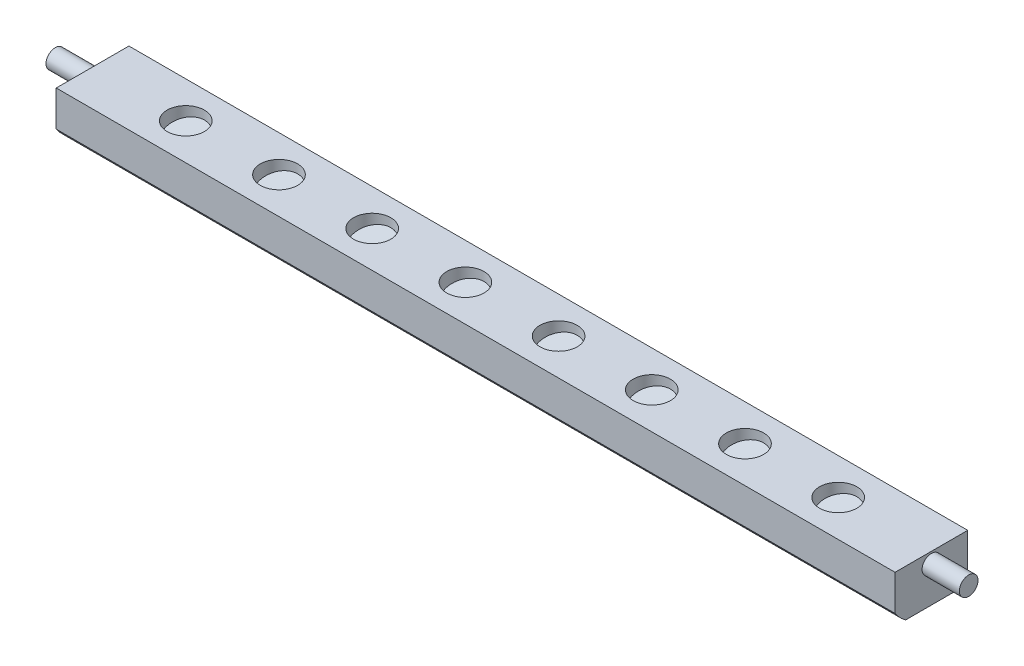
ISO-10303-21;
HEADER;
FILE_DESCRIPTION(('STEP AP214'),'2;1');
FILE_NAME('part.step','',(''),(''),'','','');
FILE_SCHEMA(('AUTOMOTIVE_DESIGN { 1 0 10303 214 1 1 1 1 }'));
ENDSEC;
DATA;
#1=APPLICATION_CONTEXT('core data for automotive mechanical design processes');
#2=APPLICATION_PROTOCOL_DEFINITION('international standard','automotive_design',2000,#1);
#3=PRODUCT_CONTEXT('',#1,'mechanical');
#4=PRODUCT('Part','Part','',(#3));
#5=PRODUCT_RELATED_PRODUCT_CATEGORY('part','',(#4));
#6=PRODUCT_DEFINITION_FORMATION('','',#4);
#7=PRODUCT_DEFINITION_CONTEXT('part definition',#1,'design');
#8=PRODUCT_DEFINITION('design','',#6,#7);
#9=PRODUCT_DEFINITION_SHAPE('','',#8);
#10=(LENGTH_UNIT() NAMED_UNIT(*) SI_UNIT(.MILLI.,.METRE.));
#11=(NAMED_UNIT(*) PLANE_ANGLE_UNIT() SI_UNIT($,.RADIAN.));
#12=(NAMED_UNIT(*) SI_UNIT($,.STERADIAN.) SOLID_ANGLE_UNIT());
#13=UNCERTAINTY_MEASURE_WITH_UNIT(LENGTH_MEASURE(1.E-05),#10,'distance_accuracy_value','');
#14=(GEOMETRIC_REPRESENTATION_CONTEXT(3) GLOBAL_UNCERTAINTY_ASSIGNED_CONTEXT((#13)) GLOBAL_UNIT_ASSIGNED_CONTEXT((#10,
#11,#12)) REPRESENTATION_CONTEXT('',''));
#15=CARTESIAN_POINT('',(0.,0.,0.));
#16=DIRECTION('',(0.,0.,1.));
#17=DIRECTION('',(1.,0.,0.));
#18=AXIS2_PLACEMENT_3D('',#15,#16,#17);
#19=CARTESIAN_POINT('',(175.,0.,0.));
#20=DIRECTION('',(0.,1.,0.));
#21=DIRECTION('',(-1.,0.,0.));
#22=AXIS2_PLACEMENT_3D('',#19,#20,#21);
#23=CYLINDRICAL_SURFACE('',#22,10.);
#24=CARTESIAN_POINT('',(175.,2.67949192431123,0.));
#25=DIRECTION('',(0.,0.965925826289068,0.258819045102521));
#26=DIRECTION('',(0.,0.258819045102521,-0.965925826289068));
#27=AXIS2_PLACEMENT_3D('',#24,#25,#26);
#28=ELLIPSE('',#27,10.3527618041008,10.);
#29=CARTESIAN_POINT('',(175.,5.35898384862246,-10.));
#30=VERTEX_POINT('',#29);
#31=EDGE_CURVE('E147',#30,#30,#28,.F.);
#32=ORIENTED_EDGE('',*,*,#31,.T.);
#33=EDGE_LOOP('',(#32));
#34=FACE_BOUND('',#33,.T.);
#35=CARTESIAN_POINT('',(175.,10.,0.));
#36=DIRECTION('',(0.,1.,0.));
#37=DIRECTION('',(-1.,0.,0.));
#38=AXIS2_PLACEMENT_3D('',#35,#36,#37);
#39=CIRCLE('',#38,10.);
#40=CARTESIAN_POINT('',(165.,10.,0.));
#41=VERTEX_POINT('',#40);
#42=EDGE_CURVE('E39',#41,#41,#39,.T.);
#43=ORIENTED_EDGE('',*,*,#42,.T.);
#44=EDGE_LOOP('',(#43));
#45=FACE_BOUND('',#44,.T.);
#46=ADVANCED_FACE('F36',(#34,#45),#23,.F.);
#47=CARTESIAN_POINT('',(125.,0.,0.));
#48=DIRECTION('',(0.,1.,0.));
#49=DIRECTION('',(-1.,0.,0.));
#50=AXIS2_PLACEMENT_3D('',#47,#48,#49);
#51=CYLINDRICAL_SURFACE('',#50,10.);
#52=CARTESIAN_POINT('',(125.,2.67949192431123,0.));
#53=DIRECTION('',(0.,0.965925826289068,0.258819045102521));
#54=DIRECTION('',(0.,0.258819045102521,-0.965925826289068));
#55=AXIS2_PLACEMENT_3D('',#52,#53,#54);
#56=ELLIPSE('',#55,10.3527618041008,10.);
#57=CARTESIAN_POINT('',(125.,5.35898384862246,-10.));
#58=VERTEX_POINT('',#57);
#59=EDGE_CURVE('E144',#58,#58,#56,.F.);
#60=ORIENTED_EDGE('',*,*,#59,.T.);
#61=EDGE_LOOP('',(#60));
#62=FACE_BOUND('',#61,.T.);
#63=CARTESIAN_POINT('',(125.,10.,0.));
#64=DIRECTION('',(0.,1.,0.));
#65=DIRECTION('',(-1.,0.,0.));
#66=AXIS2_PLACEMENT_3D('',#63,#64,#65);
#67=CIRCLE('',#66,10.);
#68=CARTESIAN_POINT('',(115.,10.,0.));
#69=VERTEX_POINT('',#68);
#70=EDGE_CURVE('E178',#69,#69,#67,.T.);
#71=ORIENTED_EDGE('',*,*,#70,.T.);
#72=EDGE_LOOP('',(#71));
#73=FACE_BOUND('',#72,.T.);
#74=ADVANCED_FACE('F203',(#62,#73),#51,.F.);
#75=CARTESIAN_POINT('',(75.,0.,0.));
#76=DIRECTION('',(0.,1.,0.));
#77=DIRECTION('',(-1.,0.,0.));
#78=AXIS2_PLACEMENT_3D('',#75,#76,#77);
#79=CYLINDRICAL_SURFACE('',#78,10.);
#80=CARTESIAN_POINT('',(75.,2.67949192431123,0.));
#81=DIRECTION('',(0.,0.965925826289068,0.258819045102521));
#82=DIRECTION('',(0.,0.258819045102521,-0.965925826289068));
#83=AXIS2_PLACEMENT_3D('',#80,#81,#82);
#84=ELLIPSE('',#83,10.3527618041008,10.);
#85=CARTESIAN_POINT('',(75.,5.35898384862246,-10.));
#86=VERTEX_POINT('',#85);
#87=EDGE_CURVE('E141',#86,#86,#84,.F.);
#88=ORIENTED_EDGE('',*,*,#87,.T.);
#89=EDGE_LOOP('',(#88));
#90=FACE_BOUND('',#89,.T.);
#91=CARTESIAN_POINT('',(75.,10.,0.));
#92=DIRECTION('',(0.,1.,0.));
#93=DIRECTION('',(-1.,0.,0.));
#94=AXIS2_PLACEMENT_3D('',#91,#92,#93);
#95=CIRCLE('',#94,10.);
#96=CARTESIAN_POINT('',(65.,10.,0.));
#97=VERTEX_POINT('',#96);
#98=EDGE_CURVE('E176',#97,#97,#95,.T.);
#99=ORIENTED_EDGE('',*,*,#98,.T.);
#100=EDGE_LOOP('',(#99));
#101=FACE_BOUND('',#100,.T.);
#102=ADVANCED_FACE('F208',(#90,#101),#79,.F.);
#103=CARTESIAN_POINT('',(25.,0.,0.));
#104=DIRECTION('',(0.,1.,0.));
#105=DIRECTION('',(-1.,0.,0.));
#106=AXIS2_PLACEMENT_3D('',#103,#104,#105);
#107=CYLINDRICAL_SURFACE('',#106,10.);
#108=CARTESIAN_POINT('',(25.,2.67949192431123,0.));
#109=DIRECTION('',(0.,0.965925826289068,0.258819045102521));
#110=DIRECTION('',(0.,0.258819045102521,-0.965925826289068));
#111=AXIS2_PLACEMENT_3D('',#108,#109,#110);
#112=ELLIPSE('',#111,10.3527618041008,10.);
#113=CARTESIAN_POINT('',(25.,5.35898384862246,-10.));
#114=VERTEX_POINT('',#113);
#115=EDGE_CURVE('E138',#114,#114,#112,.F.);
#116=ORIENTED_EDGE('',*,*,#115,.T.);
#117=EDGE_LOOP('',(#116));
#118=FACE_BOUND('',#117,.T.);
#119=CARTESIAN_POINT('',(25.,10.,0.));
#120=DIRECTION('',(0.,1.,0.));
#121=DIRECTION('',(-1.,0.,0.));
#122=AXIS2_PLACEMENT_3D('',#119,#120,#121);
#123=CIRCLE('',#122,10.);
#124=CARTESIAN_POINT('',(15.,10.,0.));
#125=VERTEX_POINT('',#124);
#126=EDGE_CURVE('E173',#125,#125,#123,.T.);
#127=ORIENTED_EDGE('',*,*,#126,.T.);
#128=EDGE_LOOP('',(#127));
#129=FACE_BOUND('',#128,.T.);
#130=ADVANCED_FACE('F274',(#118,#129),#107,.F.);
#131=CARTESIAN_POINT('',(-25.,0.,0.));
#132=DIRECTION('',(0.,1.,0.));
#133=DIRECTION('',(-1.,0.,0.));
#134=AXIS2_PLACEMENT_3D('',#131,#132,#133);
#135=CYLINDRICAL_SURFACE('',#134,10.);
#136=CARTESIAN_POINT('',(-25.,2.67949192431123,0.));
#137=DIRECTION('',(0.,0.965925826289068,0.258819045102521));
#138=DIRECTION('',(0.,0.258819045102521,-0.965925826289068));
#139=AXIS2_PLACEMENT_3D('',#136,#137,#138);
#140=ELLIPSE('',#139,10.3527618041008,10.);
#141=CARTESIAN_POINT('',(-25.,5.35898384862246,-10.));
#142=VERTEX_POINT('',#141);
#143=EDGE_CURVE('E135',#142,#142,#140,.F.);
#144=ORIENTED_EDGE('',*,*,#143,.T.);
#145=EDGE_LOOP('',(#144));
#146=FACE_BOUND('',#145,.T.);
#147=CARTESIAN_POINT('',(-25.,10.,0.));
#148=DIRECTION('',(0.,1.,0.));
#149=DIRECTION('',(-1.,0.,0.));
#150=AXIS2_PLACEMENT_3D('',#147,#148,#149);
#151=CIRCLE('',#150,10.);
#152=CARTESIAN_POINT('',(-35.,9.99999999999999,0.));
#153=VERTEX_POINT('',#152);
#154=EDGE_CURVE('E170',#153,#153,#151,.T.);
#155=ORIENTED_EDGE('',*,*,#154,.T.);
#156=EDGE_LOOP('',(#155));
#157=FACE_BOUND('',#156,.T.);
#158=ADVANCED_FACE('F268',(#146,#157),#135,.F.);
#159=CARTESIAN_POINT('',(-75.,0.,0.));
#160=DIRECTION('',(0.,1.,0.));
#161=DIRECTION('',(-1.,0.,0.));
#162=AXIS2_PLACEMENT_3D('',#159,#160,#161);
#163=CYLINDRICAL_SURFACE('',#162,10.);
#164=CARTESIAN_POINT('',(-75.,2.67949192431123,0.));
#165=DIRECTION('',(0.,0.965925826289068,0.258819045102521));
#166=DIRECTION('',(0.,0.258819045102521,-0.965925826289068));
#167=AXIS2_PLACEMENT_3D('',#164,#165,#166);
#168=ELLIPSE('',#167,10.3527618041008,10.);
#169=CARTESIAN_POINT('',(-75.,5.35898384862246,-10.));
#170=VERTEX_POINT('',#169);
#171=EDGE_CURVE('E132',#170,#170,#168,.F.);
#172=ORIENTED_EDGE('',*,*,#171,.T.);
#173=EDGE_LOOP('',(#172));
#174=FACE_BOUND('',#173,.T.);
#175=CARTESIAN_POINT('',(-75.,9.99999999999999,0.));
#176=DIRECTION('',(0.,1.,0.));
#177=DIRECTION('',(-1.,0.,0.));
#178=AXIS2_PLACEMENT_3D('',#175,#176,#177);
#179=CIRCLE('',#178,10.);
#180=CARTESIAN_POINT('',(-85.,9.99999999999999,0.));
#181=VERTEX_POINT('',#180);
#182=EDGE_CURVE('E167',#181,#181,#179,.T.);
#183=ORIENTED_EDGE('',*,*,#182,.T.);
#184=EDGE_LOOP('',(#183));
#185=FACE_BOUND('',#184,.T.);
#186=ADVANCED_FACE('F263',(#174,#185),#163,.F.);
#187=CARTESIAN_POINT('',(-225.,-10.,14.));
#188=DIRECTION('',(1.,0.,0.));
#189=DIRECTION('',(0.,0.,-1.));
#190=AXIS2_PLACEMENT_3D('',#187,#188,#189);
#191=PLANE('',#190);
#192=CARTESIAN_POINT('',(-225.,4.00000000000003,0.));
#193=DIRECTION('',(1.,0.,0.));
#194=DIRECTION('',(0.,0.,-1.));
#195=AXIS2_PLACEMENT_3D('',#192,#193,#194);
#196=CIRCLE('',#195,5.);
#197=CARTESIAN_POINT('',(-225.,4.00000000000003,-5.));
#198=VERTEX_POINT('',#197);
#199=EDGE_CURVE('E150',#198,#198,#196,.T.);
#200=ORIENTED_EDGE('',*,*,#199,.T.);
#201=EDGE_LOOP('',(#200));
#202=FACE_BOUND('',#201,.T.);
#203=DIRECTION('',(0.,0.,-1.));
#204=VECTOR('',#203,1.);
#205=CARTESIAN_POINT('',(-225.,9.99999999999997,14.));
#206=LINE('',#205,#204);
#207=CARTESIAN_POINT('',(-225.,9.99999999999997,19.5));
#208=VERTEX_POINT('',#207);
#209=CARTESIAN_POINT('',(-225.,9.99999999999997,-19.5));
#210=VERTEX_POINT('',#209);
#211=EDGE_CURVE('E56',#208,#210,#206,.T.);
#212=ORIENTED_EDGE('',*,*,#211,.T.);
#213=DIRECTION('',(0.,-1.,0.));
#214=VECTOR('',#213,1.);
#215=CARTESIAN_POINT('',(-225.,9.99999999999997,-19.5));
#216=LINE('',#215,#214);
#217=CARTESIAN_POINT('',(-225.,-15.,-19.5));
#218=VERTEX_POINT('',#217);
#219=EDGE_CURVE('E51',#210,#218,#216,.T.);
#220=ORIENTED_EDGE('',*,*,#219,.T.);
#221=DIRECTION('',(0.,0.,1.));
#222=VECTOR('',#221,1.);
#223=CARTESIAN_POINT('',(-225.,-15.,-19.5));
#224=LINE('',#223,#222);
#225=CARTESIAN_POINT('',(-225.,-15.,13.8293166859393));
#226=VERTEX_POINT('',#225);
#227=EDGE_CURVE('E112',#218,#226,#224,.T.);
#228=ORIENTED_EDGE('',*,*,#227,.T.);
#229=CARTESIAN_POINT('',(-225.,3.99999999999997,0.));
#230=DIRECTION('',(1.,0.,0.));
#231=DIRECTION('',(0.,0.,-1.));
#232=AXIS2_PLACEMENT_3D('',#229,#230,#231);
#233=CIRCLE('',#232,23.5);
#234=CARTESIAN_POINT('',(-225.,-9.11487704860403,19.5));
#235=VERTEX_POINT('',#234);
#236=EDGE_CURVE('E117',#226,#235,#233,.F.);
#237=ORIENTED_EDGE('',*,*,#236,.T.);
#238=DIRECTION('',(0.,1.,0.));
#239=VECTOR('',#238,1.);
#240=CARTESIAN_POINT('',(-225.,9.99999999999997,19.5));
#241=LINE('',#240,#239);
#242=EDGE_CURVE('E87',#235,#208,#241,.T.);
#243=ORIENTED_EDGE('',*,*,#242,.T.);
#244=EDGE_LOOP('',(#212,#220,#228,#237,#243));
#245=FACE_BOUND('',#244,.T.);
#246=ADVANCED_FACE('F198',(#202,#245),#191,.F.);
#247=CARTESIAN_POINT('',(225.,-9.99999999999997,14.));
#248=DIRECTION('',(-1.,0.,0.));
#249=DIRECTION('',(0.,0.,1.));
#250=AXIS2_PLACEMENT_3D('',#247,#248,#249);
#251=PLANE('',#250);
#252=DIRECTION('',(0.,0.,-1.));
#253=VECTOR('',#252,1.);
#254=CARTESIAN_POINT('',(225.,10.,14.));
#255=LINE('',#254,#253);
#256=CARTESIAN_POINT('',(225.,9.99999999999997,19.5));
#257=VERTEX_POINT('',#256);
#258=CARTESIAN_POINT('',(225.,9.99999999999997,-19.5));
#259=VERTEX_POINT('',#258);
#260=EDGE_CURVE('E101',#257,#259,#255,.T.);
#261=ORIENTED_EDGE('',*,*,#260,.F.);
#262=DIRECTION('',(0.,1.,0.));
#263=VECTOR('',#262,1.);
#264=CARTESIAN_POINT('',(225.,9.99999999999997,19.5));
#265=LINE('',#264,#263);
#266=CARTESIAN_POINT('',(225.,-9.11487704860403,19.5));
#267=VERTEX_POINT('',#266);
#268=EDGE_CURVE('E86',#267,#257,#265,.T.);
#269=ORIENTED_EDGE('',*,*,#268,.F.);
#270=CARTESIAN_POINT('',(225.,3.99999999999997,0.));
#271=DIRECTION('',(-1.,0.,0.));
#272=DIRECTION('',(0.,0.,1.));
#273=AXIS2_PLACEMENT_3D('',#270,#271,#272);
#274=CIRCLE('',#273,23.5);
#275=CARTESIAN_POINT('',(225.,-15.,13.8293166859393));
#276=VERTEX_POINT('',#275);
#277=EDGE_CURVE('E98',#276,#267,#274,.T.);
#278=ORIENTED_EDGE('',*,*,#277,.F.);
#279=DIRECTION('',(0.,0.,1.));
#280=VECTOR('',#279,1.);
#281=CARTESIAN_POINT('',(225.,-15.,-19.5));
#282=LINE('',#281,#280);
#283=CARTESIAN_POINT('',(225.,-15.,-19.5));
#284=VERTEX_POINT('',#283);
#285=EDGE_CURVE('E106',#284,#276,#282,.T.);
#286=ORIENTED_EDGE('',*,*,#285,.F.);
#287=DIRECTION('',(0.,-1.,0.));
#288=VECTOR('',#287,1.);
#289=CARTESIAN_POINT('',(225.,9.99999999999997,-19.5));
#290=LINE('',#289,#288);
#291=EDGE_CURVE('E108',#259,#284,#290,.T.);
#292=ORIENTED_EDGE('',*,*,#291,.F.);
#293=EDGE_LOOP('',(#261,#269,#278,#286,#292));
#294=FACE_BOUND('',#293,.T.);
#295=CARTESIAN_POINT('',(225.,4.00000000000003,0.));
#296=DIRECTION('',(1.,0.,0.));
#297=DIRECTION('',(0.,0.,-1.));
#298=AXIS2_PLACEMENT_3D('',#295,#296,#297);
#299=CIRCLE('',#298,5.);
#300=CARTESIAN_POINT('',(225.,4.00000000000003,-5.));
#301=VERTEX_POINT('',#300);
#302=EDGE_CURVE('E11',#301,#301,#299,.T.);
#303=ORIENTED_EDGE('',*,*,#302,.F.);
#304=EDGE_LOOP('',(#303));
#305=FACE_BOUND('',#304,.T.);
#306=ADVANCED_FACE('F95',(#294,#305),#251,.F.);
#307=CARTESIAN_POINT('',(225.,10.,14.));
#308=DIRECTION('',(0.,-1.,0.));
#309=DIRECTION('',(1.,0.,0.));
#310=AXIS2_PLACEMENT_3D('',#307,#308,#309);
#311=PLANE('',#310);
#312=CARTESIAN_POINT('',(-125.,9.99999999999998,0.));
#313=DIRECTION('',(0.,1.,0.));
#314=DIRECTION('',(-1.,0.,0.));
#315=AXIS2_PLACEMENT_3D('',#312,#313,#314);
#316=CIRCLE('',#315,10.);
#317=CARTESIAN_POINT('',(-135.,9.99999999999998,0.));
#318=VERTEX_POINT('',#317);
#319=EDGE_CURVE('E158',#318,#318,#316,.T.);
#320=ORIENTED_EDGE('',*,*,#319,.F.);
#321=EDGE_LOOP('',(#320));
#322=FACE_BOUND('',#321,.T.);
#323=CARTESIAN_POINT('',(-175.,9.99999999999998,0.));
#324=DIRECTION('',(0.,1.,0.));
#325=DIRECTION('',(-1.,0.,0.));
#326=AXIS2_PLACEMENT_3D('',#323,#324,#325);
#327=CIRCLE('',#326,10.);
#328=CARTESIAN_POINT('',(-185.,9.99999999999998,0.));
#329=VERTEX_POINT('',#328);
#330=EDGE_CURVE('E162',#329,#329,#327,.T.);
#331=ORIENTED_EDGE('',*,*,#330,.F.);
#332=EDGE_LOOP('',(#331));
#333=FACE_BOUND('',#332,.T.);
#334=ORIENTED_EDGE('',*,*,#260,.T.);
#335=DIRECTION('',(1.,0.,0.));
#336=VECTOR('',#335,1.);
#337=CARTESIAN_POINT('',(-271.324939287602,9.99999999999997,-19.5));
#338=LINE('',#337,#336);
#339=EDGE_CURVE('E119',#210,#259,#338,.T.);
#340=ORIENTED_EDGE('',*,*,#339,.F.);
#341=ORIENTED_EDGE('',*,*,#211,.F.);
#342=DIRECTION('',(1.,0.,0.));
#343=VECTOR('',#342,1.);
#344=CARTESIAN_POINT('',(-271.324939287602,9.99999999999997,19.5));
#345=LINE('',#344,#343);
#346=EDGE_CURVE('E114',#208,#257,#345,.T.);
#347=ORIENTED_EDGE('',*,*,#346,.T.);
#348=EDGE_LOOP('',(#334,#340,#341,#347));
#349=FACE_BOUND('',#348,.T.);
#350=ORIENTED_EDGE('',*,*,#182,.F.);
#351=EDGE_LOOP('',(#350));
#352=FACE_BOUND('',#351,.T.);
#353=ORIENTED_EDGE('',*,*,#154,.F.);
#354=EDGE_LOOP('',(#353));
#355=FACE_BOUND('',#354,.T.);
#356=ORIENTED_EDGE('',*,*,#126,.F.);
#357=EDGE_LOOP('',(#356));
#358=FACE_BOUND('',#357,.T.);
#359=ORIENTED_EDGE('',*,*,#98,.F.);
#360=EDGE_LOOP('',(#359));
#361=FACE_BOUND('',#360,.T.);
#362=ORIENTED_EDGE('',*,*,#70,.F.);
#363=EDGE_LOOP('',(#362));
#364=FACE_BOUND('',#363,.T.);
#365=ORIENTED_EDGE('',*,*,#42,.F.);
#366=EDGE_LOOP('',(#365));
#367=FACE_BOUND('',#366,.T.);
#368=ADVANCED_FACE('F186',(#322,#333,#349,#352,#355,#358,#361,#364,#367),#311,.F.);
#369=CARTESIAN_POINT('',(-175.,0.,0.));
#370=DIRECTION('',(0.,1.,0.));
#371=DIRECTION('',(-1.,0.,0.));
#372=AXIS2_PLACEMENT_3D('',#369,#370,#371);
#373=CYLINDRICAL_SURFACE('',#372,10.);
#374=CARTESIAN_POINT('',(-175.,2.67949192431123,0.));
#375=DIRECTION('',(0.,0.965925826289068,0.258819045102521));
#376=DIRECTION('',(0.,0.258819045102521,-0.965925826289068));
#377=AXIS2_PLACEMENT_3D('',#374,#375,#376);
#378=ELLIPSE('',#377,10.3527618041008,10.);
#379=CARTESIAN_POINT('',(-175.,5.35898384862246,-10.));
#380=VERTEX_POINT('',#379);
#381=EDGE_CURVE('E129',#380,#380,#378,.F.);
#382=ORIENTED_EDGE('',*,*,#381,.T.);
#383=EDGE_LOOP('',(#382));
#384=FACE_BOUND('',#383,.T.);
#385=ORIENTED_EDGE('',*,*,#330,.T.);
#386=EDGE_LOOP('',(#385));
#387=FACE_BOUND('',#386,.T.);
#388=ADVANCED_FACE('F188',(#384,#387),#373,.F.);
#389=CARTESIAN_POINT('',(-125.,0.,0.));
#390=DIRECTION('',(0.,1.,0.));
#391=DIRECTION('',(-1.,0.,0.));
#392=AXIS2_PLACEMENT_3D('',#389,#390,#391);
#393=CYLINDRICAL_SURFACE('',#392,10.);
#394=CARTESIAN_POINT('',(-125.,2.67949192431123,0.));
#395=DIRECTION('',(0.,0.965925826289068,0.258819045102521));
#396=DIRECTION('',(0.,0.258819045102521,-0.965925826289068));
#397=AXIS2_PLACEMENT_3D('',#394,#395,#396);
#398=ELLIPSE('',#397,10.3527618041008,10.);
#399=CARTESIAN_POINT('',(-125.,5.35898384862246,-10.));
#400=VERTEX_POINT('',#399);
#401=EDGE_CURVE('E126',#400,#400,#398,.F.);
#402=ORIENTED_EDGE('',*,*,#401,.T.);
#403=EDGE_LOOP('',(#402));
#404=FACE_BOUND('',#403,.T.);
#405=ORIENTED_EDGE('',*,*,#319,.T.);
#406=EDGE_LOOP('',(#405));
#407=FACE_BOUND('',#406,.T.);
#408=ADVANCED_FACE('F195',(#404,#407),#393,.F.);
#409=CARTESIAN_POINT('',(245.,4.00000000000003,0.));
#410=DIRECTION('',(-1.,0.,0.));
#411=DIRECTION('',(0.,0.,1.));
#412=AXIS2_PLACEMENT_3D('',#409,#410,#411);
#413=CYLINDRICAL_SURFACE('',#412,5.);
#414=CARTESIAN_POINT('',(245.,4.00000000000003,0.));
#415=DIRECTION('',(1.,0.,0.));
#416=DIRECTION('',(0.,0.,-1.));
#417=AXIS2_PLACEMENT_3D('',#414,#415,#416);
#418=CIRCLE('',#417,5.);
#419=CARTESIAN_POINT('',(245.,4.00000000000003,-5.));
#420=VERTEX_POINT('',#419);
#421=EDGE_CURVE('E154',#420,#420,#418,.T.);
#422=ORIENTED_EDGE('',*,*,#421,.F.);
#423=EDGE_LOOP('',(#422));
#424=FACE_BOUND('',#423,.T.);
#425=ORIENTED_EDGE('',*,*,#302,.T.);
#426=EDGE_LOOP('',(#425));
#427=FACE_BOUND('',#426,.T.);
#428=ADVANCED_FACE('F242',(#424,#427),#413,.T.);
#429=CARTESIAN_POINT('',(245.,4.00000000000003,0.));
#430=DIRECTION('',(1.,0.,0.));
#431=DIRECTION('',(0.,0.,-1.));
#432=AXIS2_PLACEMENT_3D('',#429,#430,#431);
#433=PLANE('',#432);
#434=ORIENTED_EDGE('',*,*,#421,.T.);
#435=EDGE_LOOP('',(#434));
#436=FACE_BOUND('',#435,.T.);
#437=ADVANCED_FACE('F247',(#436),#433,.T.);
#438=CARTESIAN_POINT('',(-245.,4.00000000000003,0.));
#439=DIRECTION('',(1.,0.,0.));
#440=DIRECTION('',(0.,0.,-1.));
#441=AXIS2_PLACEMENT_3D('',#438,#439,#440);
#442=CYLINDRICAL_SURFACE('',#441,5.);
#443=CARTESIAN_POINT('',(-245.,4.00000000000003,0.));
#444=DIRECTION('',(1.,0.,0.));
#445=DIRECTION('',(0.,0.,-1.));
#446=AXIS2_PLACEMENT_3D('',#443,#444,#445);
#447=CIRCLE('',#446,5.);
#448=CARTESIAN_POINT('',(-245.,4.00000000000003,-5.));
#449=VERTEX_POINT('',#448);
#450=EDGE_CURVE('E151',#449,#449,#447,.T.);
#451=ORIENTED_EDGE('',*,*,#450,.T.);
#452=EDGE_LOOP('',(#451));
#453=FACE_BOUND('',#452,.T.);
#454=ORIENTED_EDGE('',*,*,#199,.F.);
#455=EDGE_LOOP('',(#454));
#456=FACE_BOUND('',#455,.T.);
#457=ADVANCED_FACE('F236',(#453,#456),#442,.T.);
#458=CARTESIAN_POINT('',(-245.,4.00000000000003,0.));
#459=DIRECTION('',(-1.,0.,0.));
#460=DIRECTION('',(0.,0.,-1.));
#461=AXIS2_PLACEMENT_3D('',#458,#459,#460);
#462=PLANE('',#461);
#463=ORIENTED_EDGE('',*,*,#450,.F.);
#464=EDGE_LOOP('',(#463));
#465=FACE_BOUND('',#464,.T.);
#466=ADVANCED_FACE('F228',(#465),#462,.T.);
#467=CARTESIAN_POINT('',(245.705523608202,0.,9.99999999999999));
#468=DIRECTION('',(0.,0.965925826289068,0.258819045102521));
#469=DIRECTION('',(0.,-0.258819045102521,0.965925826289068));
#470=AXIS2_PLACEMENT_3D('',#467,#468,#469);
#471=PLANE('',#470);
#472=ORIENTED_EDGE('',*,*,#401,.F.);
#473=EDGE_LOOP('',(#472));
#474=FACE_BOUND('',#473,.T.);
#475=ADVANCED_FACE('F216',(#474),#471,.T.);
#476=ORIENTED_EDGE('',*,*,#381,.F.);
#477=EDGE_LOOP('',(#476));
#478=FACE_BOUND('',#477,.T.);
#479=ADVANCED_FACE('F227',(#478),#471,.T.);
#480=ORIENTED_EDGE('',*,*,#171,.F.);
#481=EDGE_LOOP('',(#480));
#482=FACE_BOUND('',#481,.T.);
#483=ADVANCED_FACE('F234',(#482),#471,.T.);
#484=ORIENTED_EDGE('',*,*,#143,.F.);
#485=EDGE_LOOP('',(#484));
#486=FACE_BOUND('',#485,.T.);
#487=ADVANCED_FACE('F294',(#486),#471,.T.);
#488=ORIENTED_EDGE('',*,*,#115,.F.);
#489=EDGE_LOOP('',(#488));
#490=FACE_BOUND('',#489,.T.);
#491=ADVANCED_FACE('F290',(#490),#471,.T.);
#492=ORIENTED_EDGE('',*,*,#87,.F.);
#493=EDGE_LOOP('',(#492));
#494=FACE_BOUND('',#493,.T.);
#495=ADVANCED_FACE('F223',(#494),#471,.T.);
#496=ORIENTED_EDGE('',*,*,#59,.F.);
#497=EDGE_LOOP('',(#496));
#498=FACE_BOUND('',#497,.T.);
#499=ADVANCED_FACE('F214',(#498),#471,.T.);
#500=ORIENTED_EDGE('',*,*,#31,.F.);
#501=EDGE_LOOP('',(#500));
#502=FACE_BOUND('',#501,.T.);
#503=ADVANCED_FACE('F212',(#502),#471,.T.);
#504=CARTESIAN_POINT('',(-271.324939287602,9.99999999999997,19.5));
#505=DIRECTION('',(0.,0.,1.));
#506=DIRECTION('',(0.,-1.,0.));
#507=AXIS2_PLACEMENT_3D('',#504,#505,#506);
#508=PLANE('',#507);
#509=ORIENTED_EDGE('',*,*,#242,.F.);
#510=DIRECTION('',(1.,0.,0.));
#511=VECTOR('',#510,1.);
#512=CARTESIAN_POINT('',(-271.324939287602,-9.11487704860403,19.5));
#513=LINE('',#512,#511);
#514=EDGE_CURVE('E82',#235,#267,#513,.T.);
#515=ORIENTED_EDGE('',*,*,#514,.T.);
#516=ORIENTED_EDGE('',*,*,#268,.T.);
#517=ORIENTED_EDGE('',*,*,#346,.F.);
#518=EDGE_LOOP('',(#509,#515,#516,#517));
#519=FACE_BOUND('',#518,.T.);
#520=ADVANCED_FACE('F84',(#519),#508,.T.);
#521=CARTESIAN_POINT('',(-271.324939287602,9.99999999999997,-19.5));
#522=DIRECTION('',(0.,0.,-1.));
#523=DIRECTION('',(0.,1.,0.));
#524=AXIS2_PLACEMENT_3D('',#521,#522,#523);
#525=PLANE('',#524);
#526=ORIENTED_EDGE('',*,*,#219,.F.);
#527=ORIENTED_EDGE('',*,*,#339,.T.);
#528=ORIENTED_EDGE('',*,*,#291,.T.);
#529=DIRECTION('',(1.,0.,0.));
#530=VECTOR('',#529,1.);
#531=CARTESIAN_POINT('',(-271.324939287602,-15.,-19.5));
#532=LINE('',#531,#530);
#533=EDGE_CURVE('E122',#218,#284,#532,.T.);
#534=ORIENTED_EDGE('',*,*,#533,.F.);
#535=EDGE_LOOP('',(#526,#527,#528,#534));
#536=FACE_BOUND('',#535,.T.);
#537=ADVANCED_FACE('F221',(#536),#525,.T.);
#538=CARTESIAN_POINT('',(-271.324939287602,-15.,-19.5));
#539=DIRECTION('',(0.,-1.,0.));
#540=DIRECTION('',(0.,0.,-1.));
#541=AXIS2_PLACEMENT_3D('',#538,#539,#540);
#542=PLANE('',#541);
#543=ORIENTED_EDGE('',*,*,#227,.F.);
#544=ORIENTED_EDGE('',*,*,#533,.T.);
#545=ORIENTED_EDGE('',*,*,#285,.T.);
#546=DIRECTION('',(1.,0.,0.));
#547=VECTOR('',#546,1.);
#548=CARTESIAN_POINT('',(-271.324939287602,-15.,13.8293166859393));
#549=LINE('',#548,#547);
#550=EDGE_CURVE('E91',#226,#276,#549,.T.);
#551=ORIENTED_EDGE('',*,*,#550,.F.);
#552=EDGE_LOOP('',(#543,#544,#545,#551));
#553=FACE_BOUND('',#552,.T.);
#554=ADVANCED_FACE('F455',(#553),#542,.T.);
#555=CARTESIAN_POINT('',(-271.324939287602,3.99999999999997,0.));
#556=DIRECTION('',(1.,0.,0.));
#557=DIRECTION('',(0.,0.,-1.));
#558=AXIS2_PLACEMENT_3D('',#555,#556,#557);
#559=CYLINDRICAL_SURFACE('',#558,23.5);
#560=ORIENTED_EDGE('',*,*,#236,.F.);
#561=ORIENTED_EDGE('',*,*,#550,.T.);
#562=ORIENTED_EDGE('',*,*,#277,.T.);
#563=ORIENTED_EDGE('',*,*,#514,.F.);
#564=EDGE_LOOP('',(#560,#561,#562,#563));
#565=FACE_BOUND('',#564,.T.);
#566=ADVANCED_FACE('F104',(#565),#559,.T.);
#567=CLOSED_SHELL('',(#46,#74,#102,#130,#158,#186,#246,#306,#368,#388,#408,#428,#437,#457,#466,
#475,#479,#483,#487,#491,#495,#499,#503,#520,#537,#554,#566));
#568=MANIFOLD_SOLID_BREP('B2',#567);
#569=ADVANCED_BREP_SHAPE_REPRESENTATION('',(#18,#568),#14);
#570=SHAPE_DEFINITION_REPRESENTATION(#9,#569);
ENDSEC;
END-ISO-10303-21;
